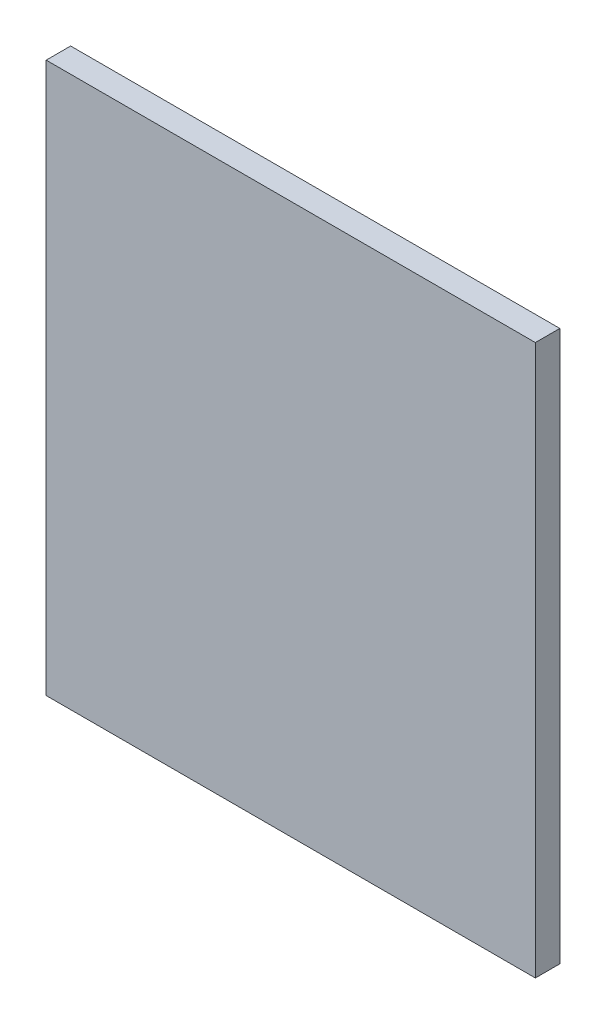
ISO-10303-21;
HEADER;
FILE_DESCRIPTION(('STEP AP214'),'2;1');
FILE_NAME('part.step','',(''),(''),'','','');
FILE_SCHEMA(('AUTOMOTIVE_DESIGN { 1 0 10303 214 1 1 1 1 }'));
ENDSEC;
DATA;
#1=APPLICATION_CONTEXT('core data for automotive mechanical design processes');
#2=APPLICATION_PROTOCOL_DEFINITION('international standard','automotive_design',2000,#1);
#3=PRODUCT_CONTEXT('',#1,'mechanical');
#4=PRODUCT('Part','Part','',(#3));
#5=PRODUCT_RELATED_PRODUCT_CATEGORY('part','',(#4));
#6=PRODUCT_DEFINITION_FORMATION('','',#4);
#7=PRODUCT_DEFINITION_CONTEXT('part definition',#1,'design');
#8=PRODUCT_DEFINITION('design','',#6,#7);
#9=PRODUCT_DEFINITION_SHAPE('','',#8);
#10=(LENGTH_UNIT() NAMED_UNIT(*) SI_UNIT(.MILLI.,.METRE.));
#11=(NAMED_UNIT(*) PLANE_ANGLE_UNIT() SI_UNIT($,.RADIAN.));
#12=(NAMED_UNIT(*) SI_UNIT($,.STERADIAN.) SOLID_ANGLE_UNIT());
#13=UNCERTAINTY_MEASURE_WITH_UNIT(LENGTH_MEASURE(1.E-05),#10,'distance_accuracy_value','');
#14=(GEOMETRIC_REPRESENTATION_CONTEXT(3) GLOBAL_UNCERTAINTY_ASSIGNED_CONTEXT((#13)) GLOBAL_UNIT_ASSIGNED_CONTEXT((#10,
#11,#12)) REPRESENTATION_CONTEXT('',''));
#15=CARTESIAN_POINT('',(0.,0.,0.));
#16=DIRECTION('',(0.,0.,1.));
#17=DIRECTION('',(1.,0.,0.));
#18=AXIS2_PLACEMENT_3D('',#15,#16,#17);
#19=CARTESIAN_POINT('',(-25.4999999999994,3.60000000000003,-0.8));
#20=DIRECTION('',(0.,1.,0.));
#21=DIRECTION('',(0.,0.,1.));
#22=AXIS2_PLACEMENT_3D('',#19,#20,#21);
#23=PLANE('',#22);
#24=DIRECTION('',(0.,0.,1.));
#25=VECTOR('',#24,1.);
#26=CARTESIAN_POINT('',(-57.4999999999994,3.60000000000003,-0.8));
#27=LINE('',#26,#25);
#28=CARTESIAN_POINT('',(-57.4999999999994,3.60000000000003,-0.8));
#29=VERTEX_POINT('',#28);
#30=CARTESIAN_POINT('',(-57.4999999999994,3.60000000000003,0.8));
#31=VERTEX_POINT('',#30);
#32=EDGE_CURVE('E40',#29,#31,#27,.T.);
#33=ORIENTED_EDGE('',*,*,#32,.T.);
#34=DIRECTION('',(-1.,0.,0.));
#35=VECTOR('',#34,1.);
#36=CARTESIAN_POINT('',(-25.4999999999994,3.60000000000003,0.8));
#37=LINE('',#36,#35);
#38=CARTESIAN_POINT('',(-25.4999999999994,3.60000000000003,0.8));
#39=VERTEX_POINT('',#38);
#40=EDGE_CURVE('E77',#39,#31,#37,.T.);
#41=ORIENTED_EDGE('',*,*,#40,.F.);
#42=DIRECTION('',(0.,0.,1.));
#43=VECTOR('',#42,1.);
#44=CARTESIAN_POINT('',(-25.4999999999994,3.60000000000003,-0.8));
#45=LINE('',#44,#43);
#46=CARTESIAN_POINT('',(-25.4999999999994,3.60000000000003,-0.8));
#47=VERTEX_POINT('',#46);
#48=EDGE_CURVE('E11',#47,#39,#45,.T.);
#49=ORIENTED_EDGE('',*,*,#48,.F.);
#50=DIRECTION('',(-1.,0.,0.));
#51=VECTOR('',#50,1.);
#52=CARTESIAN_POINT('',(-25.4999999999994,3.60000000000003,-0.8));
#53=LINE('',#52,#51);
#54=EDGE_CURVE('E78',#47,#29,#53,.T.);
#55=ORIENTED_EDGE('',*,*,#54,.T.);
#56=EDGE_LOOP('',(#33,#41,#49,#55));
#57=FACE_BOUND('',#56,.T.);
#58=ADVANCED_FACE('F37',(#57),#23,.T.);
#59=CARTESIAN_POINT('',(-25.4999999999994,-32.4,-0.8));
#60=DIRECTION('',(1.,0.,0.));
#61=DIRECTION('',(0.,1.,0.));
#62=AXIS2_PLACEMENT_3D('',#59,#60,#61);
#63=PLANE('',#62);
#64=ORIENTED_EDGE('',*,*,#48,.T.);
#65=DIRECTION('',(0.,1.,0.));
#66=VECTOR('',#65,1.);
#67=CARTESIAN_POINT('',(-25.4999999999994,-32.4,0.8));
#68=LINE('',#67,#66);
#69=CARTESIAN_POINT('',(-25.4999999999994,-32.4,0.8));
#70=VERTEX_POINT('',#69);
#71=EDGE_CURVE('E94',#70,#39,#68,.T.);
#72=ORIENTED_EDGE('',*,*,#71,.F.);
#73=DIRECTION('',(0.,0.,1.));
#74=VECTOR('',#73,1.);
#75=CARTESIAN_POINT('',(-25.4999999999994,-32.4,-0.8));
#76=LINE('',#75,#74);
#77=CARTESIAN_POINT('',(-25.4999999999994,-32.4,-0.8));
#78=VERTEX_POINT('',#77);
#79=EDGE_CURVE('E45',#78,#70,#76,.T.);
#80=ORIENTED_EDGE('',*,*,#79,.F.);
#81=DIRECTION('',(0.,1.,0.));
#82=VECTOR('',#81,1.);
#83=CARTESIAN_POINT('',(-25.4999999999994,-32.4,-0.8));
#84=LINE('',#83,#82);
#85=EDGE_CURVE('E83',#78,#47,#84,.T.);
#86=ORIENTED_EDGE('',*,*,#85,.T.);
#87=EDGE_LOOP('',(#64,#72,#80,#86));
#88=FACE_BOUND('',#87,.T.);
#89=ADVANCED_FACE('F109',(#88),#63,.T.);
#90=CARTESIAN_POINT('',(-57.4999999999994,-32.4,-0.8));
#91=DIRECTION('',(0.,-1.,0.));
#92=DIRECTION('',(1.,0.,0.));
#93=AXIS2_PLACEMENT_3D('',#90,#91,#92);
#94=PLANE('',#93);
#95=ORIENTED_EDGE('',*,*,#79,.T.);
#96=DIRECTION('',(1.,0.,0.));
#97=VECTOR('',#96,1.);
#98=CARTESIAN_POINT('',(-57.4999999999994,-32.4,0.8));
#99=LINE('',#98,#97);
#100=CARTESIAN_POINT('',(-57.4999999999994,-32.4,0.8));
#101=VERTEX_POINT('',#100);
#102=EDGE_CURVE('E90',#101,#70,#99,.T.);
#103=ORIENTED_EDGE('',*,*,#102,.F.);
#104=DIRECTION('',(0.,0.,1.));
#105=VECTOR('',#104,1.);
#106=CARTESIAN_POINT('',(-57.4999999999994,-32.4,-0.8));
#107=LINE('',#106,#105);
#108=CARTESIAN_POINT('',(-57.4999999999994,-32.4,-0.8));
#109=VERTEX_POINT('',#108);
#110=EDGE_CURVE('E82',#109,#101,#107,.T.);
#111=ORIENTED_EDGE('',*,*,#110,.F.);
#112=DIRECTION('',(1.,0.,0.));
#113=VECTOR('',#112,1.);
#114=CARTESIAN_POINT('',(-57.4999999999994,-32.4,-0.8));
#115=LINE('',#114,#113);
#116=EDGE_CURVE('E102',#109,#78,#115,.T.);
#117=ORIENTED_EDGE('',*,*,#116,.T.);
#118=EDGE_LOOP('',(#95,#103,#111,#117));
#119=FACE_BOUND('',#118,.T.);
#120=ADVANCED_FACE('F106',(#119),#94,.T.);
#121=CARTESIAN_POINT('',(-57.4999999999994,3.60000000000003,-0.8));
#122=DIRECTION('',(-1.,0.,0.));
#123=DIRECTION('',(0.,-1.,0.));
#124=AXIS2_PLACEMENT_3D('',#121,#122,#123);
#125=PLANE('',#124);
#126=ORIENTED_EDGE('',*,*,#110,.T.);
#127=DIRECTION('',(0.,-1.,0.));
#128=VECTOR('',#127,1.);
#129=CARTESIAN_POINT('',(-57.4999999999994,3.60000000000003,0.8));
#130=LINE('',#129,#128);
#131=EDGE_CURVE('E85',#31,#101,#130,.T.);
#132=ORIENTED_EDGE('',*,*,#131,.F.);
#133=ORIENTED_EDGE('',*,*,#32,.F.);
#134=DIRECTION('',(0.,-1.,0.));
#135=VECTOR('',#134,1.);
#136=CARTESIAN_POINT('',(-57.4999999999994,3.60000000000003,-0.8));
#137=LINE('',#136,#135);
#138=EDGE_CURVE('E100',#29,#109,#137,.T.);
#139=ORIENTED_EDGE('',*,*,#138,.T.);
#140=EDGE_LOOP('',(#126,#132,#133,#139));
#141=FACE_BOUND('',#140,.T.);
#142=ADVANCED_FACE('F86',(#141),#125,.T.);
#143=CARTESIAN_POINT('',(0.,0.,-0.8));
#144=DIRECTION('',(0.,0.,1.));
#145=DIRECTION('',(1.,0.,0.));
#146=AXIS2_PLACEMENT_3D('',#143,#144,#145);
#147=PLANE('',#146);
#148=ORIENTED_EDGE('',*,*,#54,.F.);
#149=ORIENTED_EDGE('',*,*,#85,.F.);
#150=ORIENTED_EDGE('',*,*,#116,.F.);
#151=ORIENTED_EDGE('',*,*,#138,.F.);
#152=EDGE_LOOP('',(#148,#149,#150,#151));
#153=FACE_BOUND('',#152,.T.);
#154=ADVANCED_FACE('F111',(#153),#147,.F.);
#155=CARTESIAN_POINT('',(0.,0.,0.8));
#156=DIRECTION('',(0.,0.,1.));
#157=DIRECTION('',(1.,0.,0.));
#158=AXIS2_PLACEMENT_3D('',#155,#156,#157);
#159=PLANE('',#158);
#160=ORIENTED_EDGE('',*,*,#40,.T.);
#161=ORIENTED_EDGE('',*,*,#131,.T.);
#162=ORIENTED_EDGE('',*,*,#102,.T.);
#163=ORIENTED_EDGE('',*,*,#71,.T.);
#164=EDGE_LOOP('',(#160,#161,#162,#163));
#165=FACE_BOUND('',#164,.T.);
#166=ADVANCED_FACE('F93',(#165),#159,.T.);
#167=CLOSED_SHELL('',(#58,#89,#120,#142,#154,#166));
#168=MANIFOLD_SOLID_BREP('B2',#167);
#169=ADVANCED_BREP_SHAPE_REPRESENTATION('',(#18,#168),#14);
#170=SHAPE_DEFINITION_REPRESENTATION(#9,#169);
ENDSEC;
END-ISO-10303-21;
